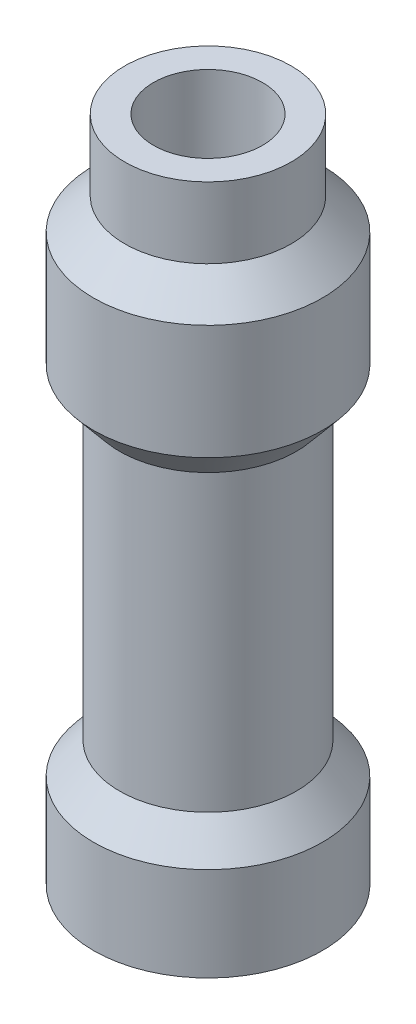
ISO-10303-21;
HEADER;
FILE_DESCRIPTION(('STEP AP214'),'2;1');
FILE_NAME('part.step','',(''),(''),'','','');
FILE_SCHEMA(('AUTOMOTIVE_DESIGN { 1 0 10303 214 1 1 1 1 }'));
ENDSEC;
DATA;
#1=APPLICATION_CONTEXT('core data for automotive mechanical design processes');
#2=APPLICATION_PROTOCOL_DEFINITION('international standard','automotive_design',2000,#1);
#3=PRODUCT_CONTEXT('',#1,'mechanical');
#4=PRODUCT('Part','Part','',(#3));
#5=PRODUCT_RELATED_PRODUCT_CATEGORY('part','',(#4));
#6=PRODUCT_DEFINITION_FORMATION('','',#4);
#7=PRODUCT_DEFINITION_CONTEXT('part definition',#1,'design');
#8=PRODUCT_DEFINITION('design','',#6,#7);
#9=PRODUCT_DEFINITION_SHAPE('','',#8);
#10=(LENGTH_UNIT() NAMED_UNIT(*) SI_UNIT(.MILLI.,.METRE.));
#11=(NAMED_UNIT(*) PLANE_ANGLE_UNIT() SI_UNIT($,.RADIAN.));
#12=(NAMED_UNIT(*) SI_UNIT($,.STERADIAN.) SOLID_ANGLE_UNIT());
#13=UNCERTAINTY_MEASURE_WITH_UNIT(LENGTH_MEASURE(1.E-05),#10,'distance_accuracy_value','');
#14=(GEOMETRIC_REPRESENTATION_CONTEXT(3) GLOBAL_UNCERTAINTY_ASSIGNED_CONTEXT((#13)) GLOBAL_UNIT_ASSIGNED_CONTEXT((#10,
#11,#12)) REPRESENTATION_CONTEXT('',''));
#15=CARTESIAN_POINT('',(0.,0.,0.));
#16=DIRECTION('',(0.,0.,1.));
#17=DIRECTION('',(1.,0.,0.));
#18=AXIS2_PLACEMENT_3D('',#15,#16,#17);
#19=CARTESIAN_POINT('',(0.,0.,0.));
#20=DIRECTION('',(0.,-1.,0.));
#21=DIRECTION('',(0.,0.,-1.));
#22=AXIS2_PLACEMENT_3D('',#19,#20,#21);
#23=PLANE('',#22);
#24=CARTESIAN_POINT('',(0.,0.,0.));
#25=DIRECTION('',(0.,-1.,0.));
#26=DIRECTION('',(0.,0.,-1.));
#27=AXIS2_PLACEMENT_3D('',#24,#25,#26);
#28=CIRCLE('',#27,1.45);
#29=CARTESIAN_POINT('',(0.,0.,-1.45));
#30=VERTEX_POINT('',#29);
#31=EDGE_CURVE('E74',#30,#30,#28,.T.);
#32=ORIENTED_EDGE('',*,*,#31,.F.);
#33=EDGE_LOOP('',(#32));
#34=FACE_BOUND('',#33,.T.);
#35=CARTESIAN_POINT('',(0.,0.,0.));
#36=DIRECTION('',(0.,-1.,0.));
#37=DIRECTION('',(0.,0.,-1.));
#38=AXIS2_PLACEMENT_3D('',#35,#36,#37);
#39=CIRCLE('',#38,5.49);
#40=CARTESIAN_POINT('',(0.,0.,-5.49));
#41=VERTEX_POINT('',#40);
#42=EDGE_CURVE('E10',#41,#41,#39,.T.);
#43=ORIENTED_EDGE('',*,*,#42,.T.);
#44=EDGE_LOOP('',(#43));
#45=FACE_BOUND('',#44,.T.);
#46=ADVANCED_FACE('F34',(#34,#45),#23,.T.);
#47=CARTESIAN_POINT('',(0.,0.,0.));
#48=DIRECTION('',(0.,-1.,0.));
#49=DIRECTION('',(0.,0.,-1.));
#50=AXIS2_PLACEMENT_3D('',#47,#48,#49);
#51=CYLINDRICAL_SURFACE('',#50,5.49);
#52=CARTESIAN_POINT('',(0.,4.5,0.));
#53=DIRECTION('',(0.,-1.,0.));
#54=DIRECTION('',(0.,0.,-1.));
#55=AXIS2_PLACEMENT_3D('',#52,#53,#54);
#56=CIRCLE('',#55,5.49);
#57=CARTESIAN_POINT('',(0.,4.5,-5.49));
#58=VERTEX_POINT('',#57);
#59=EDGE_CURVE('E40',#58,#58,#56,.T.);
#60=ORIENTED_EDGE('',*,*,#59,.T.);
#61=EDGE_LOOP('',(#60));
#62=FACE_BOUND('',#61,.T.);
#63=ORIENTED_EDGE('',*,*,#42,.F.);
#64=EDGE_LOOP('',(#63));
#65=FACE_BOUND('',#64,.T.);
#66=ADVANCED_FACE('F128',(#62,#65),#51,.T.);
#67=CARTESIAN_POINT('',(0.,4.5,0.));
#68=DIRECTION('',(0.,-1.,0.));
#69=DIRECTION('',(0.,0.,-1.));
#70=AXIS2_PLACEMENT_3D('',#67,#68,#69);
#71=CONICAL_SURFACE('',#70,5.49,0.694738276196703);
#72=CARTESIAN_POINT('',(0.,6.,0.));
#73=DIRECTION('',(0.,-1.,0.));
#74=DIRECTION('',(0.,0.,-1.));
#75=AXIS2_PLACEMENT_3D('',#72,#73,#74);
#76=CIRCLE('',#75,4.24);
#77=CARTESIAN_POINT('',(0.,6.,-4.24));
#78=VERTEX_POINT('',#77);
#79=EDGE_CURVE('E44',#78,#78,#76,.T.);
#80=ORIENTED_EDGE('',*,*,#79,.T.);
#81=EDGE_LOOP('',(#80));
#82=FACE_BOUND('',#81,.T.);
#83=ORIENTED_EDGE('',*,*,#59,.F.);
#84=EDGE_LOOP('',(#83));
#85=FACE_BOUND('',#84,.T.);
#86=ADVANCED_FACE('F133',(#82,#85),#71,.T.);
#87=CARTESIAN_POINT('',(0.,0.,0.));
#88=DIRECTION('',(0.,-1.,0.));
#89=DIRECTION('',(0.,0.,-1.));
#90=AXIS2_PLACEMENT_3D('',#87,#88,#89);
#91=CYLINDRICAL_SURFACE('',#90,4.24);
#92=CARTESIAN_POINT('',(0.,20.11,0.));
#93=DIRECTION('',(0.,-1.,0.));
#94=DIRECTION('',(0.,0.,-1.));
#95=AXIS2_PLACEMENT_3D('',#92,#93,#94);
#96=CIRCLE('',#95,4.24);
#97=CARTESIAN_POINT('',(0.,20.11,-4.24));
#98=VERTEX_POINT('',#97);
#99=EDGE_CURVE('E48',#98,#98,#96,.T.);
#100=ORIENTED_EDGE('',*,*,#99,.T.);
#101=EDGE_LOOP('',(#100));
#102=FACE_BOUND('',#101,.T.);
#103=ORIENTED_EDGE('',*,*,#79,.F.);
#104=EDGE_LOOP('',(#103));
#105=FACE_BOUND('',#104,.T.);
#106=ADVANCED_FACE('F149',(#102,#105),#91,.T.);
#107=CARTESIAN_POINT('',(0.,20.11,0.));
#108=DIRECTION('',(0.,1.,0.));
#109=DIRECTION('',(0.,0.,1.));
#110=AXIS2_PLACEMENT_3D('',#107,#108,#109);
#111=CONICAL_SURFACE('',#110,4.24,0.694738276196703);
#112=CARTESIAN_POINT('',(0.,21.61,0.));
#113=DIRECTION('',(0.,-1.,0.));
#114=DIRECTION('',(0.,0.,-1.));
#115=AXIS2_PLACEMENT_3D('',#112,#113,#114);
#116=CIRCLE('',#115,5.49);
#117=CARTESIAN_POINT('',(0.,21.61,-5.49));
#118=VERTEX_POINT('',#117);
#119=EDGE_CURVE('E53',#118,#118,#116,.T.);
#120=ORIENTED_EDGE('',*,*,#119,.T.);
#121=EDGE_LOOP('',(#120));
#122=FACE_BOUND('',#121,.T.);
#123=ORIENTED_EDGE('',*,*,#99,.F.);
#124=EDGE_LOOP('',(#123));
#125=FACE_BOUND('',#124,.T.);
#126=ADVANCED_FACE('F124',(#122,#125),#111,.T.);
#127=CARTESIAN_POINT('',(0.,0.,0.));
#128=DIRECTION('',(0.,-1.,0.));
#129=DIRECTION('',(0.,0.,-1.));
#130=AXIS2_PLACEMENT_3D('',#127,#128,#129);
#131=CYLINDRICAL_SURFACE('',#130,5.49);
#132=CARTESIAN_POINT('',(0.,25.61,-5.49));
#133=CARTESIAN_POINT('',(0.0692557276663428,25.6099977392896,-5.48999873777239));
#134=CARTESIAN_POINT('',(0.138538173626386,25.6042249559309,-5.48867627343598));
#135=CARTESIAN_POINT('',(0.275130254223166,25.5813132082646,-5.48352853897269));
#136=CARTESIAN_POINT('',(0.342438527186814,25.564166582888,-5.47970158192009));
#137=CARTESIAN_POINT('',(0.473088910840441,25.5190758939686,-5.46997033089206));
#138=CARTESIAN_POINT('',(0.536435249682934,25.4911435774701,-5.46406829757276));
#139=CARTESIAN_POINT('',(0.657540995311013,25.4253128246396,-5.45082156565937));
#140=CARTESIAN_POINT('',(0.715300453391309,25.3874144798203,-5.44347688031254));
#141=CARTESIAN_POINT('',(0.824593783986598,25.3020338867952,-5.42800538232624));
#142=CARTESIAN_POINT('',(0.876017166051756,25.2544120702785,-5.41986820317307));
#143=CARTESIAN_POINT('',(0.970219933289474,25.1512357497404,-5.40380070232543));
#144=CARTESIAN_POINT('',(1.01299849514972,25.0956804910157,-5.39587040039603));
#145=CARTESIAN_POINT('',(1.08919354502776,24.9773861412388,-5.38101175402224));
#146=CARTESIAN_POINT('',(1.12249077505122,24.9145684205193,-5.37409666146589));
#147=CARTESIAN_POINT('',(1.1780124750391,24.7840452912011,-5.36220087552568));
#148=CARTESIAN_POINT('',(1.20023838868058,24.7163405211826,-5.3572199299517));
#149=CARTESIAN_POINT('',(1.23261814225522,24.5791684091005,-5.34986226297177));
#150=CARTESIAN_POINT('',(1.24296846460369,24.5097497675001,-5.34744320833825));
#151=CARTESIAN_POINT('',(1.25191447319125,24.3701224535189,-5.34535619815071));
#152=CARTESIAN_POINT('',(1.25051173000012,24.2999138879483,-5.34568787501458));
#153=CARTESIAN_POINT('',(1.23614917133497,24.162172497743,-5.34902660000994));
#154=CARTESIAN_POINT('',(1.22341918088803,24.0946142221127,-5.35198044272025));
#155=CARTESIAN_POINT('',(1.1871282831421,23.9626181536293,-5.36014637376684));
#156=CARTESIAN_POINT('',(1.1635667228605,23.8981805491652,-5.36535859824886));
#157=CARTESIAN_POINT('',(1.10607469122651,23.7736170831445,-5.37750544429932));
#158=CARTESIAN_POINT('',(1.07205721847919,23.7135328353587,-5.38445442274478));
#159=CARTESIAN_POINT('',(0.994680070414754,23.599841066802,-5.3992831936569));
#160=CARTESIAN_POINT('',(0.951319021416758,23.5462345001824,-5.40716312291374));
#161=CARTESIAN_POINT('',(0.855276131419397,23.4456982203897,-5.42319305686727));
#162=CARTESIAN_POINT('',(0.802399252816022,23.3989549482198,-5.43134505740089));
#163=CARTESIAN_POINT('',(0.689463107339602,23.3149676110136,-5.44683248753992));
#164=CARTESIAN_POINT('',(0.629403688412611,23.2777237471314,-5.45416789985185));
#165=CARTESIAN_POINT('',(0.503569285143361,23.2137403509909,-5.46722268194508));
#166=CARTESIAN_POINT('',(0.43778062465136,23.1870268439869,-5.47293803817573));
#167=CARTESIAN_POINT('',(0.302488721593626,23.1450867902919,-5.48207913651262));
#168=CARTESIAN_POINT('',(0.232986067309171,23.1298584301426,-5.48550524007289));
#169=CARTESIAN_POINT('',(0.0938368912793283,23.111595817862,-5.4896297942133));
#170=CARTESIAN_POINT('',(0.0242254065443179,23.1083071095136,-5.49038515405237));
#171=CARTESIAN_POINT('',(-0.114552437794111,23.11332521788,-5.48924330175358));
#172=CARTESIAN_POINT('',(-0.183718829877029,23.121631178639,-5.48734628542266));
#173=CARTESIAN_POINT('',(-0.318788748433038,23.1493921378293,-5.48114890319143));
#174=CARTESIAN_POINT('',(-0.384721461966799,23.1687122038924,-5.47687763940448));
#175=CARTESIAN_POINT('',(-0.51240952115708,23.217801991709,-5.46641053191639));
#176=CARTESIAN_POINT('',(-0.574164490537441,23.2475726532239,-5.46021451513915));
#177=CARTESIAN_POINT('',(-0.692785443589114,23.3172385020767,-5.44644578038369));
#178=CARTESIAN_POINT('',(-0.749562428126465,23.357281274036,-5.43885349460861));
#179=CARTESIAN_POINT('',(-0.855682123991814,23.4461619362342,-5.42317163565047));
#180=CARTESIAN_POINT('',(-0.905023781459951,23.4950010710924,-5.41508199220185));
#181=CARTESIAN_POINT('',(-0.995890095402821,23.6012599332989,-5.39911827712044));
#182=CARTESIAN_POINT('',(-1.03723786161061,23.6588322869677,-5.39125179762127));
#183=CARTESIAN_POINT('',(-1.10967993977554,23.7802524331769,-5.37680949293741));
#184=CARTESIAN_POINT('',(-1.14077470534128,23.8440999479322,-5.37023361065991));
#185=CARTESIAN_POINT('',(-1.19161018212625,23.9759106526855,-5.35918299538106));
#186=CARTESIAN_POINT('',(-1.21141642094958,24.0438475054927,-5.35469616429171));
#187=CARTESIAN_POINT('',(-1.23930029416451,24.1822015020635,-5.34831217913759));
#188=CARTESIAN_POINT('',(-1.24737998657682,24.252618208388,-5.34641457066514));
#189=CARTESIAN_POINT('',(-1.25148820149163,24.3921452823555,-5.34545420098891));
#190=CARTESIAN_POINT('',(-1.24779775068788,24.4612470661776,-5.34632533100574));
#191=CARTESIAN_POINT('',(-1.22910277761802,24.5978160148058,-5.35065385880261));
#192=CARTESIAN_POINT('',(-1.2140984124805,24.6652832022999,-5.35411122066483));
#193=CARTESIAN_POINT('',(-1.17334235147171,24.7964220412321,-5.36318912227474));
#194=CARTESIAN_POINT('',(-1.14763480236854,24.8601080696671,-5.36880076904919));
#195=CARTESIAN_POINT('',(-1.08623889562245,24.9823037539236,-5.38155775080727));
#196=CARTESIAN_POINT('',(-1.05054939964583,25.0408128183657,-5.38870326068989));
#197=CARTESIAN_POINT('',(-0.969284634605953,25.1523717224431,-5.40391787900872));
#198=CARTESIAN_POINT('',(-0.923510499563064,25.2052744399592,-5.41200374936228));
#199=CARTESIAN_POINT('',(-0.823774700133442,25.3027396626685,-5.42807901916907));
#200=CARTESIAN_POINT('',(-0.769811135329137,25.3473002266285,-5.43606839576442));
#201=CARTESIAN_POINT('',(-0.654296544411126,25.4274304907531,-5.451186441576));
#202=CARTESIAN_POINT('',(-0.592647948237723,25.4628623320691,-5.45830115011494));
#203=CARTESIAN_POINT('',(-0.464118727106083,25.5228040610163,-5.47072644709541));
#204=CARTESIAN_POINT('',(-0.39724237018681,25.5473227510886,-5.4760384887258));
#205=CARTESIAN_POINT('',(-0.275288555586693,25.5805691770142,-5.48335587902654));
#206=CARTESIAN_POINT('',(-0.220851178160024,25.5915839406075,-5.48583154354226));
#207=CARTESIAN_POINT('',(-0.110948214270398,25.6063000686269,-5.4891540675314));
#208=CARTESIAN_POINT('',(-0.0554826811101294,25.6100018111177,-5.49000101120549));
#209=CARTESIAN_POINT('',(0.,25.61,-5.49));
#210=B_SPLINE_CURVE_WITH_KNOTS('',3,(#132,#133,#134,#135,#136,#137,#138,#139,#140,#141,#142,
#143,#144,#145,#146,#147,#148,#149,#150,#151,#152,#153,#154,#155,#156,#157,#158,#159,#160,#161,
#162,#163,#164,#165,#166,#167,#168,#169,#170,#171,#172,#173,#174,#175,#176,#177,#178,#179,#180,
#181,#182,#183,#184,#185,#186,#187,#188,#189,#190,#191,#192,#193,#194,#195,#196,#197,#198,#199,
#200,#201,#202,#203,#204,#205,#206,#207,#208,#209),.UNSPECIFIED.,.T.,.F.,(4,2,2,2,2,2,2,2,2,2,2,
2,2,2,2,2,2,2,2,2,2,2,2,2,2,2,2,2,2,2,2,2,2,2,2,2,2,2,4),(0.,0.207564031755906,
0.415268014398944,0.622746415107821,0.830222910718829,1.04091832416979,1.25163379430862,
1.46489311855642,1.67812462693902,1.8877748886819,2.09739713517113,2.30286082725037,
2.5083369073597,2.71557124326247,2.92283606731022,3.134970053262,3.34710853087275,
3.55976805955051,3.77239400311182,3.98046097716101,4.18851259184845,4.39406854309584,
4.59964298353463,4.80835486869611,5.01709630825508,5.23002991532662,5.44295410062213,
5.65462937551563,5.86626749669108,6.0728906604961,6.27951095475406,6.48528732788875,
6.69108717718058,6.90138130149745,7.11172430095006,7.3250788381541,7.53826097242466,
7.70455486286609,7.8708401561104),.UNSPECIFIED.);
#211=CARTESIAN_POINT('',(0.,25.61,-5.49));
#212=VERTEX_POINT('',#211);
#213=EDGE_CURVE('E77',#212,#212,#210,.T.);
#214=ORIENTED_EDGE('',*,*,#213,.F.);
#215=EDGE_LOOP('',(#214));
#216=FACE_BOUND('',#215,.T.);
#217=CARTESIAN_POINT('',(0.,27.11,0.));
#218=DIRECTION('',(0.,-1.,0.));
#219=DIRECTION('',(0.,0.,-1.));
#220=AXIS2_PLACEMENT_3D('',#217,#218,#219);
#221=CIRCLE('',#220,5.49);
#222=CARTESIAN_POINT('',(0.,27.11,-5.49));
#223=VERTEX_POINT('',#222);
#224=EDGE_CURVE('E56',#223,#223,#221,.T.);
#225=ORIENTED_EDGE('',*,*,#224,.T.);
#226=EDGE_LOOP('',(#225));
#227=FACE_BOUND('',#226,.T.);
#228=ORIENTED_EDGE('',*,*,#119,.F.);
#229=EDGE_LOOP('',(#228));
#230=FACE_BOUND('',#229,.T.);
#231=ADVANCED_FACE('F88',(#216,#227,#230),#131,.T.);
#232=CARTESIAN_POINT('',(0.,27.11,0.));
#233=DIRECTION('',(0.,-1.,0.));
#234=DIRECTION('',(0.,0.,-1.));
#235=AXIS2_PLACEMENT_3D('',#232,#233,#234);
#236=CONICAL_SURFACE('',#235,5.49,0.783728715866594);
#237=CARTESIAN_POINT('',(0.,28.61,0.));
#238=DIRECTION('',(0.,-1.,0.));
#239=DIRECTION('',(0.,0.,-1.));
#240=AXIS2_PLACEMENT_3D('',#237,#238,#239);
#241=CIRCLE('',#240,3.995);
#242=CARTESIAN_POINT('',(0.,28.61,-3.995));
#243=VERTEX_POINT('',#242);
#244=EDGE_CURVE('E59',#243,#243,#241,.T.);
#245=ORIENTED_EDGE('',*,*,#244,.T.);
#246=EDGE_LOOP('',(#245));
#247=FACE_BOUND('',#246,.T.);
#248=ORIENTED_EDGE('',*,*,#224,.F.);
#249=EDGE_LOOP('',(#248));
#250=FACE_BOUND('',#249,.T.);
#251=ADVANCED_FACE('F117',(#247,#250),#236,.T.);
#252=CARTESIAN_POINT('',(0.,0.,0.));
#253=DIRECTION('',(0.,-1.,0.));
#254=DIRECTION('',(0.,0.,-1.));
#255=AXIS2_PLACEMENT_3D('',#252,#253,#254);
#256=CYLINDRICAL_SURFACE('',#255,3.995);
#257=CARTESIAN_POINT('',(0.,32.01,0.));
#258=DIRECTION('',(0.,-1.,0.));
#259=DIRECTION('',(0.,0.,-1.));
#260=AXIS2_PLACEMENT_3D('',#257,#258,#259);
#261=CIRCLE('',#260,3.995);
#262=CARTESIAN_POINT('',(0.,32.01,-3.995));
#263=VERTEX_POINT('',#262);
#264=EDGE_CURVE('E62',#263,#263,#261,.T.);
#265=ORIENTED_EDGE('',*,*,#264,.T.);
#266=EDGE_LOOP('',(#265));
#267=FACE_BOUND('',#266,.T.);
#268=ORIENTED_EDGE('',*,*,#244,.F.);
#269=EDGE_LOOP('',(#268));
#270=FACE_BOUND('',#269,.T.);
#271=ADVANCED_FACE('F114',(#267,#270),#256,.T.);
#272=CARTESIAN_POINT('',(3.995,32.01,0.));
#273=DIRECTION('',(0.,1.,0.));
#274=DIRECTION('',(0.,0.,1.));
#275=AXIS2_PLACEMENT_3D('',#272,#273,#274);
#276=PLANE('',#275);
#277=CARTESIAN_POINT('',(0.,32.01,0.));
#278=DIRECTION('',(0.,-1.,0.));
#279=DIRECTION('',(0.,0.,-1.));
#280=AXIS2_PLACEMENT_3D('',#277,#278,#279);
#281=CIRCLE('',#280,2.615);
#282=CARTESIAN_POINT('',(0.,32.01,-2.615));
#283=VERTEX_POINT('',#282);
#284=EDGE_CURVE('E65',#283,#283,#281,.T.);
#285=ORIENTED_EDGE('',*,*,#284,.T.);
#286=EDGE_LOOP('',(#285));
#287=FACE_BOUND('',#286,.T.);
#288=ORIENTED_EDGE('',*,*,#264,.F.);
#289=EDGE_LOOP('',(#288));
#290=FACE_BOUND('',#289,.T.);
#291=ADVANCED_FACE('F110',(#287,#290),#276,.T.);
#292=CARTESIAN_POINT('',(0.,0.,0.));
#293=DIRECTION('',(0.,-1.,0.));
#294=DIRECTION('',(0.,0.,-1.));
#295=AXIS2_PLACEMENT_3D('',#292,#293,#294);
#296=CYLINDRICAL_SURFACE('',#295,2.615);
#297=CARTESIAN_POINT('',(0.,25.61,-2.615));
#298=CARTESIAN_POINT('',(-0.0660564734551539,25.6099961724261,-2.6149967472963));
#299=CARTESIAN_POINT('',(-0.13220181895979,25.6047330112321,-2.61246972601888));
#300=CARTESIAN_POINT('',(-0.262559050410929,25.5839030327976,-2.60261070801091));
#301=CARTESIAN_POINT('',(-0.326766552649648,25.5683144535673,-2.59526856318531));
#302=CARTESIAN_POINT('',(-0.451159611578536,25.5275708442748,-2.5765522897271));
#303=CARTESIAN_POINT('',(-0.51135932870164,25.5024518558066,-2.56519336241492));
#304=CARTESIAN_POINT('',(-0.626611141906981,25.4435362858678,-2.53950282902058));
#305=CARTESIAN_POINT('',(-0.681663942223092,25.4097408939352,-2.52517163048961));
#306=CARTESIAN_POINT('',(-0.788572645163376,25.3322426982436,-2.49392329234214));
#307=CARTESIAN_POINT('',(-0.840070325203635,25.2880868121454,-2.47690560616813));
#308=CARTESIAN_POINT('',(-0.93525404904236,25.1920902732191,-2.4425581220506));
#309=CARTESIAN_POINT('',(-0.978934684577958,25.1402443450025,-2.42522811708218));
#310=CARTESIAN_POINT('',(-1.06026721766314,25.0260188784203,-2.39084544312556));
#311=CARTESIAN_POINT('',(-1.09729195810183,24.9631584641628,-2.3738951297364));
#312=CARTESIAN_POINT('',(-1.16008783798159,24.8311955127565,-2.34385183724101));
#313=CARTESIAN_POINT('',(-1.18586646550801,24.7620971661692,-2.3307562933796));
#314=CARTESIAN_POINT('',(-1.22385236268428,24.6236906903034,-2.31102742005972));
#315=CARTESIAN_POINT('',(-1.23675298847251,24.5546217241685,-2.30406663580417));
#316=CARTESIAN_POINT('',(-1.25075588878473,24.4149771566702,-2.29649850047441));
#317=CARTESIAN_POINT('',(-1.25186812674484,24.3444028781497,-2.29588578408193));
#318=CARTESIAN_POINT('',(-1.24277432201174,24.2118489146008,-2.30081538485986));
#319=CARTESIAN_POINT('',(-1.23376598593065,24.1497572517278,-2.30570646300128));
#320=CARTESIAN_POINT('',(-1.20674339136366,24.0281044078036,-2.31996256843657));
#321=CARTESIAN_POINT('',(-1.18872664777395,23.9685439299396,-2.32932883024502));
#322=CARTESIAN_POINT('',(-1.14385156804321,23.8519667341227,-2.35169445321963));
#323=CARTESIAN_POINT('',(-1.11679747275004,23.7950413091482,-2.36477319345026));
#324=CARTESIAN_POINT('',(-1.05476118748025,23.686276734687,-2.39308693310836));
#325=CARTESIAN_POINT('',(-1.01977548623777,23.6344398524704,-2.40832288639377));
#326=CARTESIAN_POINT('',(-0.938186313732656,23.531071089895,-2.44134798190135));
#327=CARTESIAN_POINT('',(-0.89071102052101,23.4802546006637,-2.45922964987032));
#328=CARTESIAN_POINT('',(-0.787805223511096,23.3870222090887,-2.49410086806306));
#329=CARTESIAN_POINT('',(-0.732371538296471,23.344609682497,-2.51109005778546));
#330=CARTESIAN_POINT('',(-0.61235604770154,23.2678526940116,-2.54307781783174));
#331=CARTESIAN_POINT('',(-0.547501493459483,23.2338880730393,-2.55797271611932));
#332=CARTESIAN_POINT('',(-0.412104939961482,23.1776155533372,-2.5832387669864));
#333=CARTESIAN_POINT('',(-0.341567127626087,23.1552991622467,-2.59361321437132));
#334=CARTESIAN_POINT('',(-0.202699271868809,23.1246584115178,-2.6079928466548));
#335=CARTESIAN_POINT('',(-0.13462488045046,23.1153799949747,-2.61243101590114));
#336=CARTESIAN_POINT('',(0.00224978016408206,23.1081270975603,-2.61589346129109));
#337=CARTESIAN_POINT('',(0.0710497359937277,23.110147921333,-2.61491998622372));
#338=CARTESIAN_POINT('',(0.202356132805765,23.1248428167451,-2.60793079478608));
#339=CARTESIAN_POINT('',(0.264967866391074,23.1367674442231,-2.6022698764918));
#340=CARTESIAN_POINT('',(0.387191671033928,23.1697935285523,-2.58691001425368));
#341=CARTESIAN_POINT('',(0.446803397127477,23.1908960380694,-2.577210607117));
#342=CARTESIAN_POINT('',(0.563395410256274,23.2422935060587,-2.55430005272498));
#343=CARTESIAN_POINT('',(0.620242373233187,23.2728461768575,-2.54099193859269));
#344=CARTESIAN_POINT('',(0.728200605206164,23.3419931315185,-2.51218543196714));
#345=CARTESIAN_POINT('',(0.779309349821552,23.3805909334649,-2.49668608221774));
#346=CARTESIAN_POINT('',(0.879284251342965,23.4688206129763,-2.46335307285079));
#347=CARTESIAN_POINT('',(0.927518192227423,23.5191386577417,-2.44543555045987));
#348=CARTESIAN_POINT('',(1.01511415803136,23.6272732275508,-2.41039389106122));
#349=CARTESIAN_POINT('',(1.05447133157297,23.6850938258694,-2.39327019193962));
#350=CARTESIAN_POINT('',(1.12454686221571,23.8093914521834,-2.36117846378369));
#351=CARTESIAN_POINT('',(1.15488558587784,23.8761119096785,-2.34631545105728));
#352=CARTESIAN_POINT('',(1.20358362864867,24.0146577265958,-2.32171656836577));
#353=CARTESIAN_POINT('',(1.22195697386636,24.0864769990909,-2.31197469786578));
#354=CARTESIAN_POINT('',(1.24462230782765,24.2260510609189,-2.29984577336997));
#355=CARTESIAN_POINT('',(1.25005942800808,24.2935674727935,-2.29686184998121));
#356=CARTESIAN_POINT('',(1.24993965247185,24.4285773635339,-2.29692793583321));
#357=CARTESIAN_POINT('',(1.24438632671485,24.4960708427263,-2.29997598574478));
#358=CARTESIAN_POINT('',(1.22348897388855,24.6234529102813,-2.31115120844753));
#359=CARTESIAN_POINT('',(1.20896447481849,24.6835177128163,-2.31885216304023));
#360=CARTESIAN_POINT('',(1.17148833156877,24.8003176346106,-2.33800776994654));
#361=CARTESIAN_POINT('',(1.14853412476279,24.8570517352488,-2.34946356361513));
#362=CARTESIAN_POINT('',(1.0931130515487,24.9697611051804,-2.37577943531474));
#363=CARTESIAN_POINT('',(1.06011247905785,25.0254316329026,-2.39081600086569));
#364=CARTESIAN_POINT('',(0.986164984137649,25.1307955591787,-2.42225459312952));
#365=CARTESIAN_POINT('',(0.945214181883134,25.1804860201174,-2.43865728429037));
#366=CARTESIAN_POINT('',(0.85135907498115,25.2780109344052,-2.47308880788824));
#367=CARTESIAN_POINT('',(0.797643599826268,25.3250739864863,-2.49110325350558));
#368=CARTESIAN_POINT('',(0.682515042224518,25.4096543803545,-2.52507361703581));
#369=CARTESIAN_POINT('',(0.621098192054069,25.4471670224111,-2.54102851955683));
#370=CARTESIAN_POINT('',(0.492120340107153,25.5113022116382,-2.56912260475828));
#371=CARTESIAN_POINT('',(0.424569382193616,25.537942182025,-2.58126788498676));
#372=CARTESIAN_POINT('',(0.285296242183347,25.5791583469602,-2.60033331447948));
#373=CARTESIAN_POINT('',(0.213586966651004,25.5937699332222,-2.60726878751177));
#374=CARTESIAN_POINT('',(0.117706681871859,25.6046703105027,-2.61245612396248));
#375=CARTESIAN_POINT('',(0.0942236651976891,25.6066665738475,-2.61340799187039));
#376=CARTESIAN_POINT('',(0.0471642111674813,25.6093321177403,-2.61468051813138));
#377=CARTESIAN_POINT('',(0.0235877716057749,25.610001366769,-2.6150011614915));
#378=CARTESIAN_POINT('',(0.,25.61,-2.615));
#379=B_SPLINE_CURVE_WITH_KNOTS('',3,(#297,#298,#299,#300,#301,#302,#303,#304,#305,#306,#307,
#308,#309,#310,#311,#312,#313,#314,#315,#316,#317,#318,#319,#320,#321,#322,#323,#324,#325,#326,
#327,#328,#329,#330,#331,#332,#333,#334,#335,#336,#337,#338,#339,#340,#341,#342,#343,#344,#345,
#346,#347,#348,#349,#350,#351,#352,#353,#354,#355,#356,#357,#358,#359,#360,#361,#362,#363,#364,
#365,#366,#367,#368,#369,#370,#371,#372,#373,#374,#375,#376,#377,#378),.UNSPECIFIED.,.T.,.F.,(4,
2,2,2,2,2,2,2,2,2,2,2,2,2,2,2,2,2,2,2,2,2,2,2,2,2,2,2,2,2,2,2,2,2,2,2,2,2,2,2,4),(0.,
0.198073266019071,0.396565327925298,0.594314106641344,0.792035788391573,1.00096765667541,
1.21004352138454,1.43360124394447,1.65700988532055,1.86760971899664,2.07803154143666,
2.26594991578348,2.45392015884671,2.64625909669679,2.83868334847761,3.05315398448004,
3.26771059641573,3.4906476806133,3.7134220005091,3.91885273638455,4.12419811265149,
4.31528546302881,4.50639473613244,4.70325974440674,4.90021102178127,5.11516845807691,
5.33024309090298,5.55338917867263,5.77627321604625,5.97854438369513,6.18074985961529,
6.36676506426235,6.55283686429893,6.75135811665209,6.94997649484219,7.16990901992569,
7.38994956491069,7.6096361020594,7.82867391058871,7.89940121023096,7.97013018977965),.UNSPECIFIED.);
#380=CARTESIAN_POINT('',(0.,25.61,-2.615));
#381=VERTEX_POINT('',#380);
#382=EDGE_CURVE('E84',#381,#381,#379,.T.);
#383=ORIENTED_EDGE('',*,*,#382,.F.);
#384=EDGE_LOOP('',(#383));
#385=FACE_BOUND('',#384,.T.);
#386=CARTESIAN_POINT('',(0.,7.08,0.));
#387=DIRECTION('',(0.,-1.,0.));
#388=DIRECTION('',(0.,0.,-1.));
#389=AXIS2_PLACEMENT_3D('',#386,#387,#388);
#390=CIRCLE('',#389,2.615);
#391=CARTESIAN_POINT('',(0.,7.08,-2.615));
#392=VERTEX_POINT('',#391);
#393=EDGE_CURVE('E68',#392,#392,#390,.T.);
#394=ORIENTED_EDGE('',*,*,#393,.T.);
#395=EDGE_LOOP('',(#394));
#396=FACE_BOUND('',#395,.T.);
#397=ORIENTED_EDGE('',*,*,#284,.F.);
#398=EDGE_LOOP('',(#397));
#399=FACE_BOUND('',#398,.T.);
#400=ADVANCED_FACE('F106',(#385,#396,#399),#296,.F.);
#401=CARTESIAN_POINT('',(2.615,7.08,0.));
#402=DIRECTION('',(0.,1.,0.));
#403=DIRECTION('',(0.,0.,1.));
#404=AXIS2_PLACEMENT_3D('',#401,#402,#403);
#405=PLANE('',#404);
#406=CARTESIAN_POINT('',(0.,7.08,0.));
#407=DIRECTION('',(0.,1.,0.));
#408=DIRECTION('',(0.,0.,1.));
#409=AXIS2_PLACEMENT_3D('',#406,#407,#408);
#410=CIRCLE('',#409,1.45);
#411=CARTESIAN_POINT('',(0.,7.08,1.45));
#412=VERTEX_POINT('',#411);
#413=EDGE_CURVE('E71',#412,#412,#410,.T.);
#414=ORIENTED_EDGE('',*,*,#413,.F.);
#415=EDGE_LOOP('',(#414));
#416=FACE_BOUND('',#415,.T.);
#417=ORIENTED_EDGE('',*,*,#393,.F.);
#418=EDGE_LOOP('',(#417));
#419=FACE_BOUND('',#418,.T.);
#420=ADVANCED_FACE('F102',(#416,#419),#405,.T.);
#421=CARTESIAN_POINT('',(0.,0.,0.));
#422=DIRECTION('',(0.,-1.,0.));
#423=DIRECTION('',(0.,0.,-1.));
#424=AXIS2_PLACEMENT_3D('',#421,#422,#423);
#425=CYLINDRICAL_SURFACE('',#424,1.45);
#426=ORIENTED_EDGE('',*,*,#31,.T.);
#427=EDGE_LOOP('',(#426));
#428=FACE_BOUND('',#427,.T.);
#429=ORIENTED_EDGE('',*,*,#413,.T.);
#430=EDGE_LOOP('',(#429));
#431=FACE_BOUND('',#430,.T.);
#432=ADVANCED_FACE('F95',(#428,#431),#425,.F.);
#433=CARTESIAN_POINT('',(0.,24.36,-5.49));
#434=DIRECTION('',(0.,0.,-1.));
#435=DIRECTION('',(-1.,0.,0.));
#436=AXIS2_PLACEMENT_3D('',#433,#434,#435);
#437=CYLINDRICAL_SURFACE('',#436,1.24999999999999);
#438=ORIENTED_EDGE('',*,*,#213,.T.);
#439=EDGE_LOOP('',(#438));
#440=FACE_BOUND('',#439,.T.);
#441=ORIENTED_EDGE('',*,*,#382,.T.);
#442=EDGE_LOOP('',(#441));
#443=FACE_BOUND('',#442,.T.);
#444=ADVANCED_FACE('F92',(#440,#443),#437,.F.);
#445=CLOSED_SHELL('',(#46,#66,#86,#106,#126,#231,#251,#271,#291,#400,#420,#432,#444));
#446=MANIFOLD_SOLID_BREP('B2',#445);
#447=ADVANCED_BREP_SHAPE_REPRESENTATION('',(#18,#446),#14);
#448=SHAPE_DEFINITION_REPRESENTATION(#9,#447);
ENDSEC;
END-ISO-10303-21;
